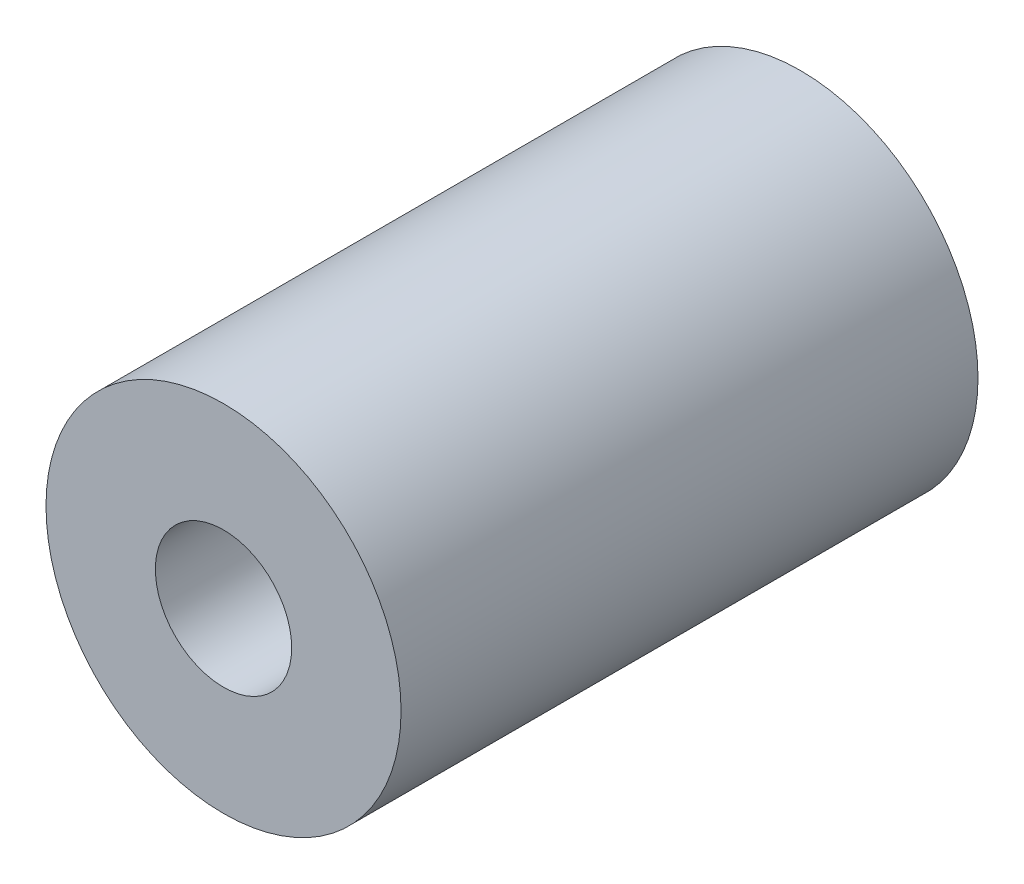
ISO-10303-21;
HEADER;
FILE_DESCRIPTION(('STEP AP214'),'2;1');
FILE_NAME('part.step','',(''),(''),'','','');
FILE_SCHEMA(('AUTOMOTIVE_DESIGN { 1 0 10303 214 1 1 1 1 }'));
ENDSEC;
DATA;
#1=APPLICATION_CONTEXT('core data for automotive mechanical design processes');
#2=APPLICATION_PROTOCOL_DEFINITION('international standard','automotive_design',2000,#1);
#3=PRODUCT_CONTEXT('',#1,'mechanical');
#4=PRODUCT('Part','Part','',(#3));
#5=PRODUCT_RELATED_PRODUCT_CATEGORY('part','',(#4));
#6=PRODUCT_DEFINITION_FORMATION('','',#4);
#7=PRODUCT_DEFINITION_CONTEXT('part definition',#1,'design');
#8=PRODUCT_DEFINITION('design','',#6,#7);
#9=PRODUCT_DEFINITION_SHAPE('','',#8);
#10=(LENGTH_UNIT() NAMED_UNIT(*) SI_UNIT(.MILLI.,.METRE.));
#11=(NAMED_UNIT(*) PLANE_ANGLE_UNIT() SI_UNIT($,.RADIAN.));
#12=(NAMED_UNIT(*) SI_UNIT($,.STERADIAN.) SOLID_ANGLE_UNIT());
#13=UNCERTAINTY_MEASURE_WITH_UNIT(LENGTH_MEASURE(1.E-05),#10,'distance_accuracy_value','');
#14=(GEOMETRIC_REPRESENTATION_CONTEXT(3) GLOBAL_UNCERTAINTY_ASSIGNED_CONTEXT((#13)) GLOBAL_UNIT_ASSIGNED_CONTEXT((#10,
#11,#12)) REPRESENTATION_CONTEXT('',''));
#15=CARTESIAN_POINT('',(0.,0.,0.));
#16=DIRECTION('',(0.,0.,1.));
#17=DIRECTION('',(1.,0.,0.));
#18=AXIS2_PLACEMENT_3D('',#15,#16,#17);
#19=CARTESIAN_POINT('',(0.,0.,10.31875));
#20=DIRECTION('',(0.,0.,1.));
#21=DIRECTION('',(1.,0.,0.));
#22=AXIS2_PLACEMENT_3D('',#19,#20,#21);
#23=PLANE('',#22);
#24=CARTESIAN_POINT('',(0.,0.,10.31875));
#25=DIRECTION('',(0.,0.,1.));
#26=DIRECTION('',(1.,0.,0.));
#27=AXIS2_PLACEMENT_3D('',#24,#25,#26);
#28=CIRCLE('',#27,6.35);
#29=CARTESIAN_POINT('',(6.35,0.,10.31875));
#30=VERTEX_POINT('',#29);
#31=EDGE_CURVE('E10',#30,#30,#28,.T.);
#32=ORIENTED_EDGE('',*,*,#31,.T.);
#33=EDGE_LOOP('',(#32));
#34=FACE_BOUND('',#33,.T.);
#35=CARTESIAN_POINT('',(0.,0.,10.31875));
#36=DIRECTION('',(0.,0.,1.));
#37=DIRECTION('',(1.,0.,0.));
#38=AXIS2_PLACEMENT_3D('',#35,#36,#37);
#39=CIRCLE('',#38,2.4384);
#40=CARTESIAN_POINT('',(2.4384,0.,10.31875));
#41=VERTEX_POINT('',#40);
#42=EDGE_CURVE('E43',#41,#41,#39,.T.);
#43=ORIENTED_EDGE('',*,*,#42,.F.);
#44=EDGE_LOOP('',(#43));
#45=FACE_BOUND('',#44,.T.);
#46=ADVANCED_FACE('F32',(#34,#45),#23,.T.);
#47=CARTESIAN_POINT('',(0.,0.,-10.31875));
#48=DIRECTION('',(0.,0.,1.));
#49=DIRECTION('',(1.,0.,0.));
#50=AXIS2_PLACEMENT_3D('',#47,#48,#49);
#51=PLANE('',#50);
#52=CARTESIAN_POINT('',(0.,0.,-10.31875));
#53=DIRECTION('',(0.,0.,1.));
#54=DIRECTION('',(1.,0.,0.));
#55=AXIS2_PLACEMENT_3D('',#52,#53,#54);
#56=CIRCLE('',#55,6.35);
#57=CARTESIAN_POINT('',(6.35,0.,-10.31875));
#58=VERTEX_POINT('',#57);
#59=EDGE_CURVE('E36',#58,#58,#56,.T.);
#60=ORIENTED_EDGE('',*,*,#59,.F.);
#61=EDGE_LOOP('',(#60));
#62=FACE_BOUND('',#61,.T.);
#63=CARTESIAN_POINT('',(0.,0.,-10.31875));
#64=DIRECTION('',(0.,0.,1.));
#65=DIRECTION('',(1.,0.,0.));
#66=AXIS2_PLACEMENT_3D('',#63,#64,#65);
#67=CIRCLE('',#66,2.4384);
#68=CARTESIAN_POINT('',(2.4384,0.,-10.31875));
#69=VERTEX_POINT('',#68);
#70=EDGE_CURVE('E45',#69,#69,#67,.T.);
#71=ORIENTED_EDGE('',*,*,#70,.T.);
#72=EDGE_LOOP('',(#71));
#73=FACE_BOUND('',#72,.T.);
#74=ADVANCED_FACE('F55',(#62,#73),#51,.F.);
#75=CARTESIAN_POINT('',(0.,0.,10.31875));
#76=DIRECTION('',(0.,0.,-1.));
#77=DIRECTION('',(-1.,0.,0.));
#78=AXIS2_PLACEMENT_3D('',#75,#76,#77);
#79=CYLINDRICAL_SURFACE('',#78,6.35);
#80=ORIENTED_EDGE('',*,*,#31,.F.);
#81=EDGE_LOOP('',(#80));
#82=FACE_BOUND('',#81,.T.);
#83=ORIENTED_EDGE('',*,*,#59,.T.);
#84=EDGE_LOOP('',(#83));
#85=FACE_BOUND('',#84,.T.);
#86=ADVANCED_FACE('F34',(#82,#85),#79,.T.);
#87=CARTESIAN_POINT('',(0.,0.,10.31875));
#88=DIRECTION('',(0.,0.,-1.));
#89=DIRECTION('',(-1.,0.,0.));
#90=AXIS2_PLACEMENT_3D('',#87,#88,#89);
#91=CYLINDRICAL_SURFACE('',#90,2.4384);
#92=ORIENTED_EDGE('',*,*,#42,.T.);
#93=EDGE_LOOP('',(#92));
#94=FACE_BOUND('',#93,.T.);
#95=ORIENTED_EDGE('',*,*,#70,.F.);
#96=EDGE_LOOP('',(#95));
#97=FACE_BOUND('',#96,.T.);
#98=ADVANCED_FACE('F51',(#94,#97),#91,.F.);
#99=CLOSED_SHELL('',(#46,#74,#86,#98));
#100=MANIFOLD_SOLID_BREP('B2',#99);
#101=ADVANCED_BREP_SHAPE_REPRESENTATION('',(#18,#100),#14);
#102=SHAPE_DEFINITION_REPRESENTATION(#9,#101);
ENDSEC;
END-ISO-10303-21;
